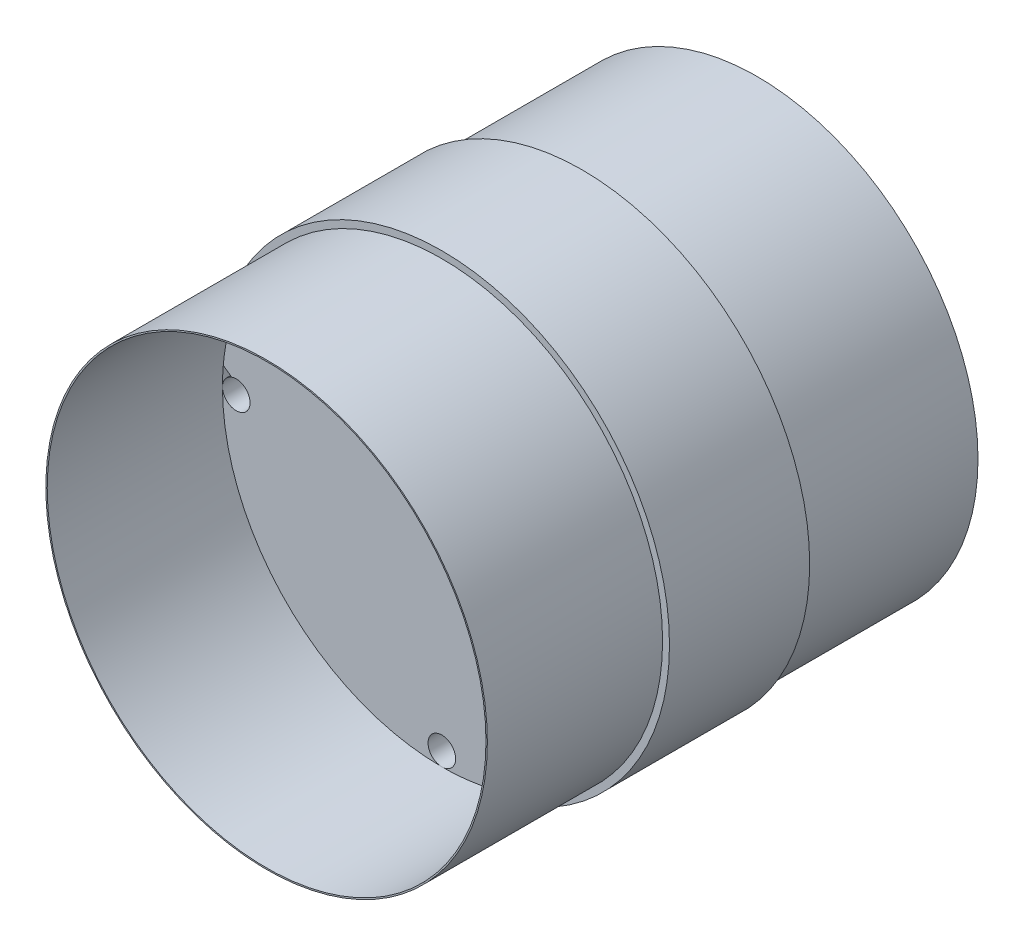
ISO-10303-21;
HEADER;
FILE_DESCRIPTION(('STEP AP214'),'2;1');
FILE_NAME('part.step','',(''),(''),'','','');
FILE_SCHEMA(('AUTOMOTIVE_DESIGN { 1 0 10303 214 1 1 1 1 }'));
ENDSEC;
DATA;
#1=APPLICATION_CONTEXT('core data for automotive mechanical design processes');
#2=APPLICATION_PROTOCOL_DEFINITION('international standard','automotive_design',2000,#1);
#3=PRODUCT_CONTEXT('',#1,'mechanical');
#4=PRODUCT('Part','Part','',(#3));
#5=PRODUCT_RELATED_PRODUCT_CATEGORY('part','',(#4));
#6=PRODUCT_DEFINITION_FORMATION('','',#4);
#7=PRODUCT_DEFINITION_CONTEXT('part definition',#1,'design');
#8=PRODUCT_DEFINITION('design','',#6,#7);
#9=PRODUCT_DEFINITION_SHAPE('','',#8);
#10=(LENGTH_UNIT() NAMED_UNIT(*) SI_UNIT(.MILLI.,.METRE.));
#11=(NAMED_UNIT(*) PLANE_ANGLE_UNIT() SI_UNIT($,.RADIAN.));
#12=(NAMED_UNIT(*) SI_UNIT($,.STERADIAN.) SOLID_ANGLE_UNIT());
#13=UNCERTAINTY_MEASURE_WITH_UNIT(LENGTH_MEASURE(1.E-05),#10,'distance_accuracy_value','');
#14=(GEOMETRIC_REPRESENTATION_CONTEXT(3) GLOBAL_UNCERTAINTY_ASSIGNED_CONTEXT((#13)) GLOBAL_UNIT_ASSIGNED_CONTEXT((#10,
#11,#12)) REPRESENTATION_CONTEXT('',''));
#15=CARTESIAN_POINT('',(0.,0.,0.));
#16=DIRECTION('',(0.,0.,1.));
#17=DIRECTION('',(1.,0.,0.));
#18=AXIS2_PLACEMENT_3D('',#15,#16,#17);
#19=CARTESIAN_POINT('',(0.,0.,50.8));
#20=DIRECTION('',(0.,0.,-1.));
#21=DIRECTION('',(-1.,0.,0.));
#22=AXIS2_PLACEMENT_3D('',#19,#20,#21);
#23=CYLINDRICAL_SURFACE('',#22,82.5);
#24=CARTESIAN_POINT('',(0.,0.,50.8));
#25=DIRECTION('',(0.,0.,1.));
#26=DIRECTION('',(1.,0.,0.));
#27=AXIS2_PLACEMENT_3D('',#24,#25,#26);
#28=CIRCLE('',#27,82.5);
#29=CARTESIAN_POINT('',(82.5,0.,50.8));
#30=VERTEX_POINT('',#29);
#31=EDGE_CURVE('E11',#30,#30,#28,.T.);
#32=ORIENTED_EDGE('',*,*,#31,.F.);
#33=EDGE_LOOP('',(#32));
#34=FACE_BOUND('',#33,.T.);
#35=CARTESIAN_POINT('',(0.,0.,0.));
#36=DIRECTION('',(0.,0.,1.));
#37=DIRECTION('',(1.,0.,0.));
#38=AXIS2_PLACEMENT_3D('',#35,#36,#37);
#39=CIRCLE('',#38,82.5);
#40=CARTESIAN_POINT('',(82.5,0.,0.));
#41=VERTEX_POINT('',#40);
#42=EDGE_CURVE('E41',#41,#41,#39,.T.);
#43=ORIENTED_EDGE('',*,*,#42,.T.);
#44=EDGE_LOOP('',(#43));
#45=FACE_BOUND('',#44,.T.);
#46=ADVANCED_FACE('F33',(#34,#45),#23,.T.);
#47=CARTESIAN_POINT('',(0.,0.,50.8));
#48=DIRECTION('',(0.,0.,1.));
#49=DIRECTION('',(1.,0.,0.));
#50=AXIS2_PLACEMENT_3D('',#47,#48,#49);
#51=PLANE('',#50);
#52=CARTESIAN_POINT('',(0.,0.,50.8));
#53=DIRECTION('',(0.,0.,1.));
#54=DIRECTION('',(1.,0.,0.));
#55=AXIS2_PLACEMENT_3D('',#52,#53,#54);
#56=CIRCLE('',#55,80.);
#57=CARTESIAN_POINT('',(80.,0.,50.8));
#58=VERTEX_POINT('',#57);
#59=EDGE_CURVE('E134',#58,#58,#56,.T.);
#60=ORIENTED_EDGE('',*,*,#59,.F.);
#61=EDGE_LOOP('',(#60));
#62=FACE_BOUND('',#61,.T.);
#63=ORIENTED_EDGE('',*,*,#31,.T.);
#64=EDGE_LOOP('',(#63));
#65=FACE_BOUND('',#64,.T.);
#66=ADVANCED_FACE('F119',(#62,#65),#51,.T.);
#67=CARTESIAN_POINT('',(0.,0.,0.));
#68=DIRECTION('',(0.,0.,1.));
#69=DIRECTION('',(1.,0.,0.));
#70=AXIS2_PLACEMENT_3D('',#67,#68,#69);
#71=PLANE('',#70);
#72=CARTESIAN_POINT('',(0.,0.,0.));
#73=DIRECTION('',(0.,0.,1.));
#74=DIRECTION('',(1.,0.,0.));
#75=AXIS2_PLACEMENT_3D('',#72,#73,#74);
#76=CIRCLE('',#75,80.);
#77=CARTESIAN_POINT('',(80.,0.,0.));
#78=VERTEX_POINT('',#77);
#79=EDGE_CURVE('E142',#78,#78,#76,.T.);
#80=ORIENTED_EDGE('',*,*,#79,.T.);
#81=EDGE_LOOP('',(#80));
#82=FACE_BOUND('',#81,.T.);
#83=ORIENTED_EDGE('',*,*,#42,.F.);
#84=EDGE_LOOP('',(#83));
#85=FACE_BOUND('',#84,.T.);
#86=ADVANCED_FACE('F124',(#82,#85),#71,.F.);
#87=CARTESIAN_POINT('',(0.,0.,114.3));
#88=DIRECTION('',(0.,0.,-1.));
#89=DIRECTION('',(-1.,0.,0.));
#90=AXIS2_PLACEMENT_3D('',#87,#88,#89);
#91=CYLINDRICAL_SURFACE('',#90,80.);
#92=CARTESIAN_POINT('',(0.,0.,114.3));
#93=DIRECTION('',(0.,0.,1.));
#94=DIRECTION('',(1.,0.,0.));
#95=AXIS2_PLACEMENT_3D('',#92,#93,#94);
#96=CIRCLE('',#95,80.);
#97=CARTESIAN_POINT('',(80.,0.,114.3));
#98=VERTEX_POINT('',#97);
#99=EDGE_CURVE('E132',#98,#98,#96,.T.);
#100=ORIENTED_EDGE('',*,*,#99,.F.);
#101=EDGE_LOOP('',(#100));
#102=FACE_BOUND('',#101,.T.);
#103=ORIENTED_EDGE('',*,*,#59,.T.);
#104=EDGE_LOOP('',(#103));
#105=FACE_BOUND('',#104,.T.);
#106=ADVANCED_FACE('F199',(#102,#105),#91,.T.);
#107=CARTESIAN_POINT('',(0.,0.,114.3));
#108=DIRECTION('',(0.,0.,1.));
#109=DIRECTION('',(1.,0.,0.));
#110=AXIS2_PLACEMENT_3D('',#107,#108,#109);
#111=PLANE('',#110);
#112=CARTESIAN_POINT('',(0.,0.,114.3));
#113=DIRECTION('',(0.,0.,1.));
#114=DIRECTION('',(1.,0.,0.));
#115=AXIS2_PLACEMENT_3D('',#112,#113,#114);
#116=CIRCLE('',#115,79.5);
#117=CARTESIAN_POINT('',(79.5,0.,114.3));
#118=VERTEX_POINT('',#117);
#119=EDGE_CURVE('E148',#118,#118,#116,.T.);
#120=ORIENTED_EDGE('',*,*,#119,.F.);
#121=EDGE_LOOP('',(#120));
#122=FACE_BOUND('',#121,.T.);
#123=ORIENTED_EDGE('',*,*,#99,.T.);
#124=EDGE_LOOP('',(#123));
#125=FACE_BOUND('',#124,.T.);
#126=ADVANCED_FACE('F195',(#122,#125),#111,.T.);
#127=CARTESIAN_POINT('',(0.,0.,-63.5));
#128=DIRECTION('',(0.,0.,1.));
#129=DIRECTION('',(1.,0.,0.));
#130=AXIS2_PLACEMENT_3D('',#127,#128,#129);
#131=CYLINDRICAL_SURFACE('',#130,80.);
#132=CARTESIAN_POINT('',(0.,0.,-63.5));
#133=DIRECTION('',(0.,0.,1.));
#134=DIRECTION('',(1.,0.,0.));
#135=AXIS2_PLACEMENT_3D('',#132,#133,#134);
#136=CIRCLE('',#135,80.);
#137=CARTESIAN_POINT('',(80.,0.,-63.5));
#138=VERTEX_POINT('',#137);
#139=EDGE_CURVE('E139',#138,#138,#136,.T.);
#140=ORIENTED_EDGE('',*,*,#139,.T.);
#141=EDGE_LOOP('',(#140));
#142=FACE_BOUND('',#141,.T.);
#143=ORIENTED_EDGE('',*,*,#79,.F.);
#144=EDGE_LOOP('',(#143));
#145=FACE_BOUND('',#144,.T.);
#146=ADVANCED_FACE('F191',(#142,#145),#131,.T.);
#147=CARTESIAN_POINT('',(0.,0.,-63.5));
#148=DIRECTION('',(0.,0.,1.));
#149=DIRECTION('',(1.,0.,0.));
#150=AXIS2_PLACEMENT_3D('',#147,#148,#149);
#151=PLANE('',#150);
#152=CARTESIAN_POINT('',(0.,0.,-63.5));
#153=DIRECTION('',(0.,0.,1.));
#154=DIRECTION('',(1.,0.,0.));
#155=AXIS2_PLACEMENT_3D('',#152,#153,#154);
#156=CIRCLE('',#155,79.5);
#157=CARTESIAN_POINT('',(79.5,0.,-63.5));
#158=VERTEX_POINT('',#157);
#159=EDGE_CURVE('E86',#158,#158,#156,.T.);
#160=ORIENTED_EDGE('',*,*,#159,.T.);
#161=EDGE_LOOP('',(#160));
#162=FACE_BOUND('',#161,.T.);
#163=ORIENTED_EDGE('',*,*,#139,.F.);
#164=EDGE_LOOP('',(#163));
#165=FACE_BOUND('',#164,.T.);
#166=ADVANCED_FACE('F188',(#162,#165),#151,.F.);
#167=CARTESIAN_POINT('',(0.,0.,50.8));
#168=DIRECTION('',(0.,0.,1.));
#169=DIRECTION('',(1.,0.,0.));
#170=AXIS2_PLACEMENT_3D('',#167,#168,#169);
#171=CYLINDRICAL_SURFACE('',#170,79.5);
#172=CARTESIAN_POINT('',(0.,0.,50.8));
#173=DIRECTION('',(0.,0.,1.));
#174=DIRECTION('',(1.,0.,0.));
#175=AXIS2_PLACEMENT_3D('',#172,#173,#174);
#176=CIRCLE('',#175,79.5);
#177=CARTESIAN_POINT('',(-79.5,-2.25952589971718E-12,50.8));
#178=VERTEX_POINT('',#177);
#179=CARTESIAN_POINT('',(4.49957991532779E-12,-79.5,50.8));
#180=VERTEX_POINT('',#179);
#181=EDGE_CURVE('E145',#178,#180,#176,.T.);
#182=ORIENTED_EDGE('',*,*,#181,.F.);
#183=CARTESIAN_POINT('',(0.,79.5,50.8));
#184=VERTEX_POINT('',#183);
#185=EDGE_CURVE('E151',#184,#178,#176,.T.);
#186=ORIENTED_EDGE('',*,*,#185,.F.);
#187=CARTESIAN_POINT('',(79.5,2.24978995766383E-12,50.8));
#188=VERTEX_POINT('',#187);
#189=EDGE_CURVE('E170',#188,#184,#176,.T.);
#190=ORIENTED_EDGE('',*,*,#189,.F.);
#191=EDGE_CURVE('E153',#180,#188,#176,.T.);
#192=ORIENTED_EDGE('',*,*,#191,.F.);
#193=EDGE_LOOP('',(#182,#186,#190,#192));
#194=FACE_BOUND('',#193,.T.);
#195=ORIENTED_EDGE('',*,*,#119,.T.);
#196=EDGE_LOOP('',(#195));
#197=FACE_BOUND('',#196,.T.);
#198=ADVANCED_FACE('F166',(#194,#197),#171,.F.);
#199=CARTESIAN_POINT('',(0.,0.,50.8));
#200=DIRECTION('',(0.,0.,1.));
#201=DIRECTION('',(1.,0.,0.));
#202=AXIS2_PLACEMENT_3D('',#199,#200,#201);
#203=PLANE('',#202);
#204=ORIENTED_EDGE('',*,*,#181,.T.);
#205=CARTESIAN_POINT('',(4.2165874678229E-12,-74.5,50.8));
#206=DIRECTION('',(0.,0.,1.));
#207=DIRECTION('',(1.,0.,0.));
#208=AXIS2_PLACEMENT_3D('',#205,#206,#207);
#209=CIRCLE('',#208,5.00000000000453);
#210=EDGE_CURVE('E101',#180,#180,#209,.T.);
#211=ORIENTED_EDGE('',*,*,#210,.F.);
#212=ORIENTED_EDGE('',*,*,#191,.T.);
#213=CARTESIAN_POINT('',(74.5000000000021,2.10829373391145E-12,50.8));
#214=DIRECTION('',(0.,0.,1.));
#215=DIRECTION('',(1.,0.,0.));
#216=AXIS2_PLACEMENT_3D('',#213,#214,#215);
#217=CIRCLE('',#216,5.00000000000165);
#218=EDGE_CURVE('E52',#188,#188,#217,.T.);
#219=ORIENTED_EDGE('',*,*,#218,.F.);
#220=ORIENTED_EDGE('',*,*,#189,.T.);
#221=CARTESIAN_POINT('',(0.,74.5,50.8));
#222=DIRECTION('',(0.,0.,1.));
#223=DIRECTION('',(1.,0.,0.));
#224=AXIS2_PLACEMENT_3D('',#221,#222,#223);
#225=CIRCLE('',#224,5.);
#226=EDGE_CURVE('E47',#184,#184,#225,.T.);
#227=ORIENTED_EDGE('',*,*,#226,.F.);
#228=ORIENTED_EDGE('',*,*,#185,.T.);
#229=CARTESIAN_POINT('',(-74.4999999999979,-2.1174173525651E-12,50.8));
#230=DIRECTION('',(0.,0.,1.));
#231=DIRECTION('',(1.,0.,0.));
#232=AXIS2_PLACEMENT_3D('',#229,#230,#231);
#233=CIRCLE('',#232,5.00000000000339);
#234=EDGE_CURVE('E91',#178,#178,#233,.T.);
#235=ORIENTED_EDGE('',*,*,#234,.F.);
#236=EDGE_LOOP('',(#204,#211,#212,#219,#220,#227,#228,#235));
#237=FACE_BOUND('',#236,.T.);
#238=ADVANCED_FACE('F161',(#237),#203,.T.);
#239=CARTESIAN_POINT('',(0.,0.,0.));
#240=DIRECTION('',(0.,0.,-1.));
#241=DIRECTION('',(-1.,0.,0.));
#242=AXIS2_PLACEMENT_3D('',#239,#240,#241);
#243=CYLINDRICAL_SURFACE('',#242,79.5);
#244=CARTESIAN_POINT('',(0.,0.,0.));
#245=DIRECTION('',(0.,0.,1.));
#246=DIRECTION('',(1.,0.,0.));
#247=AXIS2_PLACEMENT_3D('',#244,#245,#246);
#248=CIRCLE('',#247,79.5);
#249=CARTESIAN_POINT('',(-79.5,-2.25952589971718E-12,0.));
#250=VERTEX_POINT('',#249);
#251=CARTESIAN_POINT('',(4.49957991532779E-12,-79.5,0.));
#252=VERTEX_POINT('',#251);
#253=EDGE_CURVE('E80',#250,#252,#248,.T.);
#254=ORIENTED_EDGE('',*,*,#253,.T.);
#255=CARTESIAN_POINT('',(79.5,2.24978995766383E-12,0.));
#256=VERTEX_POINT('',#255);
#257=EDGE_CURVE('E106',#252,#256,#248,.T.);
#258=ORIENTED_EDGE('',*,*,#257,.T.);
#259=CARTESIAN_POINT('',(0.,79.5,0.));
#260=VERTEX_POINT('',#259);
#261=EDGE_CURVE('E82',#256,#260,#248,.T.);
#262=ORIENTED_EDGE('',*,*,#261,.T.);
#263=EDGE_CURVE('E74',#260,#250,#248,.T.);
#264=ORIENTED_EDGE('',*,*,#263,.T.);
#265=EDGE_LOOP('',(#254,#258,#262,#264));
#266=FACE_BOUND('',#265,.T.);
#267=ORIENTED_EDGE('',*,*,#159,.F.);
#268=EDGE_LOOP('',(#267));
#269=FACE_BOUND('',#268,.T.);
#270=ADVANCED_FACE('F76',(#266,#269),#243,.F.);
#271=CARTESIAN_POINT('',(0.,0.,0.));
#272=DIRECTION('',(0.,0.,1.));
#273=DIRECTION('',(1.,0.,0.));
#274=AXIS2_PLACEMENT_3D('',#271,#272,#273);
#275=PLANE('',#274);
#276=ORIENTED_EDGE('',*,*,#257,.F.);
#277=CARTESIAN_POINT('',(4.2165874678229E-12,-74.5,0.));
#278=DIRECTION('',(0.,0.,1.));
#279=DIRECTION('',(1.,0.,0.));
#280=AXIS2_PLACEMENT_3D('',#277,#278,#279);
#281=CIRCLE('',#280,5.00000000000453);
#282=EDGE_CURVE('E36',#252,#252,#281,.T.);
#283=ORIENTED_EDGE('',*,*,#282,.T.);
#284=ORIENTED_EDGE('',*,*,#253,.F.);
#285=CARTESIAN_POINT('',(-74.4999999999979,-2.1174173525651E-12,0.));
#286=DIRECTION('',(0.,0.,1.));
#287=DIRECTION('',(1.,0.,0.));
#288=AXIS2_PLACEMENT_3D('',#285,#286,#287);
#289=CIRCLE('',#288,5.00000000000339);
#290=EDGE_CURVE('E89',#250,#250,#289,.T.);
#291=ORIENTED_EDGE('',*,*,#290,.T.);
#292=ORIENTED_EDGE('',*,*,#263,.F.);
#293=CARTESIAN_POINT('',(0.,74.5,0.));
#294=DIRECTION('',(0.,0.,1.));
#295=DIRECTION('',(1.,0.,0.));
#296=AXIS2_PLACEMENT_3D('',#293,#294,#295);
#297=CIRCLE('',#296,5.);
#298=EDGE_CURVE('E99',#260,#260,#297,.T.);
#299=ORIENTED_EDGE('',*,*,#298,.T.);
#300=ORIENTED_EDGE('',*,*,#261,.F.);
#301=CARTESIAN_POINT('',(74.5000000000021,2.10829373391145E-12,0.));
#302=DIRECTION('',(0.,0.,1.));
#303=DIRECTION('',(1.,0.,0.));
#304=AXIS2_PLACEMENT_3D('',#301,#302,#303);
#305=CIRCLE('',#304,5.00000000000165);
#306=EDGE_CURVE('E100',#256,#256,#305,.T.);
#307=ORIENTED_EDGE('',*,*,#306,.T.);
#308=EDGE_LOOP('',(#276,#283,#284,#291,#292,#299,#300,#307));
#309=FACE_BOUND('',#308,.T.);
#310=ADVANCED_FACE('F105',(#309),#275,.F.);
#311=CARTESIAN_POINT('',(-74.4999999999979,-2.1174173525651E-12,-12.7));
#312=DIRECTION('',(0.,0.,1.));
#313=DIRECTION('',(1.,0.,0.));
#314=AXIS2_PLACEMENT_3D('',#311,#312,#313);
#315=CYLINDRICAL_SURFACE('',#314,5.00000000000339);
#316=ORIENTED_EDGE('',*,*,#234,.T.);
#317=EDGE_LOOP('',(#316));
#318=FACE_BOUND('',#317,.T.);
#319=ORIENTED_EDGE('',*,*,#290,.F.);
#320=EDGE_LOOP('',(#319));
#321=FACE_BOUND('',#320,.T.);
#322=ADVANCED_FACE('F90',(#318,#321),#315,.F.);
#323=CARTESIAN_POINT('',(0.,74.5,-12.7));
#324=DIRECTION('',(0.,0.,1.));
#325=DIRECTION('',(1.,0.,0.));
#326=AXIS2_PLACEMENT_3D('',#323,#324,#325);
#327=CYLINDRICAL_SURFACE('',#326,5.);
#328=ORIENTED_EDGE('',*,*,#226,.T.);
#329=EDGE_LOOP('',(#328));
#330=FACE_BOUND('',#329,.T.);
#331=ORIENTED_EDGE('',*,*,#298,.F.);
#332=EDGE_LOOP('',(#331));
#333=FACE_BOUND('',#332,.T.);
#334=ADVANCED_FACE('F116',(#330,#333),#327,.F.);
#335=CARTESIAN_POINT('',(74.5000000000021,2.10829373391145E-12,-12.7));
#336=DIRECTION('',(0.,0.,1.));
#337=DIRECTION('',(1.,0.,0.));
#338=AXIS2_PLACEMENT_3D('',#335,#336,#337);
#339=CYLINDRICAL_SURFACE('',#338,5.00000000000165);
#340=ORIENTED_EDGE('',*,*,#218,.T.);
#341=EDGE_LOOP('',(#340));
#342=FACE_BOUND('',#341,.T.);
#343=ORIENTED_EDGE('',*,*,#306,.F.);
#344=EDGE_LOOP('',(#343));
#345=FACE_BOUND('',#344,.T.);
#346=ADVANCED_FACE('F110',(#342,#345),#339,.F.);
#347=CARTESIAN_POINT('',(4.2165874678229E-12,-74.5,-12.7));
#348=DIRECTION('',(0.,0.,1.));
#349=DIRECTION('',(1.,0.,0.));
#350=AXIS2_PLACEMENT_3D('',#347,#348,#349);
#351=CYLINDRICAL_SURFACE('',#350,5.00000000000453);
#352=ORIENTED_EDGE('',*,*,#210,.T.);
#353=EDGE_LOOP('',(#352));
#354=FACE_BOUND('',#353,.T.);
#355=ORIENTED_EDGE('',*,*,#282,.F.);
#356=EDGE_LOOP('',(#355));
#357=FACE_BOUND('',#356,.T.);
#358=ADVANCED_FACE('F108',(#354,#357),#351,.F.);
#359=CLOSED_SHELL('',(#46,#66,#86,#106,#126,#146,#166,#198,#238,#270,#310,#322,#334,#346,#358));
#360=MANIFOLD_SOLID_BREP('B2',#359);
#361=ADVANCED_BREP_SHAPE_REPRESENTATION('',(#18,#360),#14);
#362=SHAPE_DEFINITION_REPRESENTATION(#9,#361);
ENDSEC;
END-ISO-10303-21;
